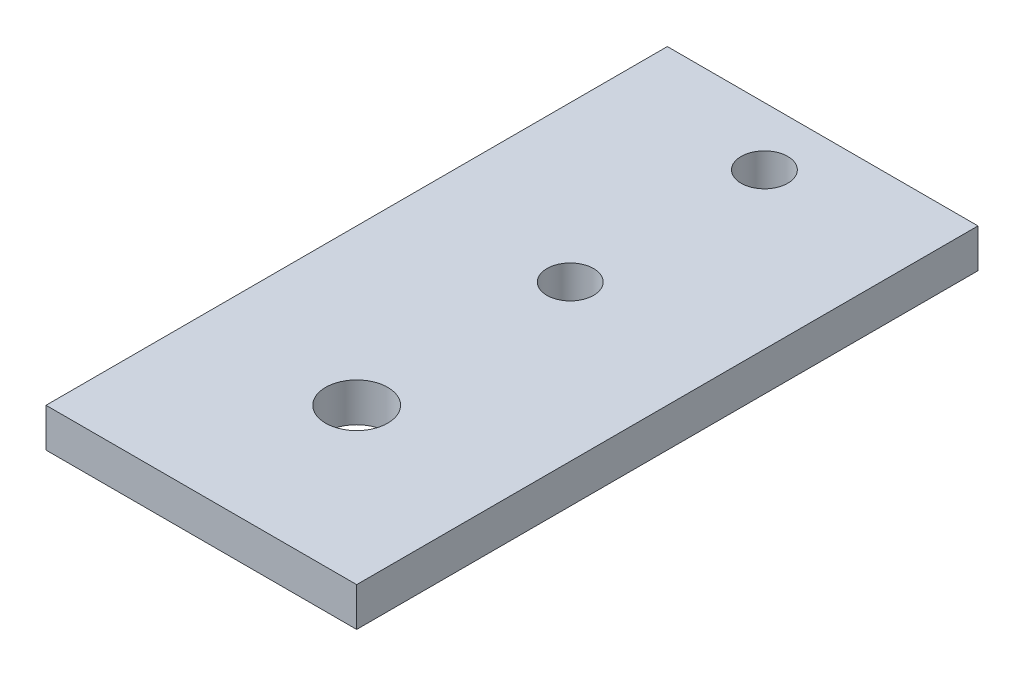
ISO-10303-21;
HEADER;
FILE_DESCRIPTION(('STEP AP214'),'2;1');
FILE_NAME('part.step','',(''),(''),'','','');
FILE_SCHEMA(('AUTOMOTIVE_DESIGN { 1 0 10303 214 1 1 1 1 }'));
ENDSEC;
DATA;
#1=APPLICATION_CONTEXT('core data for automotive mechanical design processes');
#2=APPLICATION_PROTOCOL_DEFINITION('international standard','automotive_design',2000,#1);
#3=PRODUCT_CONTEXT('',#1,'mechanical');
#4=PRODUCT('Part','Part','',(#3));
#5=PRODUCT_RELATED_PRODUCT_CATEGORY('part','',(#4));
#6=PRODUCT_DEFINITION_FORMATION('','',#4);
#7=PRODUCT_DEFINITION_CONTEXT('part definition',#1,'design');
#8=PRODUCT_DEFINITION('design','',#6,#7);
#9=PRODUCT_DEFINITION_SHAPE('','',#8);
#10=(LENGTH_UNIT() NAMED_UNIT(*) SI_UNIT(.MILLI.,.METRE.));
#11=(NAMED_UNIT(*) PLANE_ANGLE_UNIT() SI_UNIT($,.RADIAN.));
#12=(NAMED_UNIT(*) SI_UNIT($,.STERADIAN.) SOLID_ANGLE_UNIT());
#13=UNCERTAINTY_MEASURE_WITH_UNIT(LENGTH_MEASURE(1.E-05),#10,'distance_accuracy_value','');
#14=(GEOMETRIC_REPRESENTATION_CONTEXT(3) GLOBAL_UNCERTAINTY_ASSIGNED_CONTEXT((#13)) GLOBAL_UNIT_ASSIGNED_CONTEXT((#10,
#11,#12)) REPRESENTATION_CONTEXT('',''));
#15=CARTESIAN_POINT('',(0.,0.,0.));
#16=DIRECTION('',(0.,0.,1.));
#17=DIRECTION('',(1.,0.,0.));
#18=AXIS2_PLACEMENT_3D('',#15,#16,#17);
#19=CARTESIAN_POINT('',(0.,5.,0.));
#20=DIRECTION('',(0.,-1.,0.));
#21=DIRECTION('',(0.,0.,-1.));
#22=AXIS2_PLACEMENT_3D('',#19,#20,#21);
#23=PLANE('',#22);
#24=DIRECTION('',(0.,0.,1.));
#25=VECTOR('',#24,1.);
#26=CARTESIAN_POINT('',(0.,5.,0.));
#27=LINE('',#26,#25);
#28=CARTESIAN_POINT('',(0.,5.,-80.));
#29=VERTEX_POINT('',#28);
#30=CARTESIAN_POINT('',(0.,5.,0.));
#31=VERTEX_POINT('',#30);
#32=EDGE_CURVE('E84',#29,#31,#27,.T.);
#33=ORIENTED_EDGE('',*,*,#32,.T.);
#34=DIRECTION('',(1.,0.,0.));
#35=VECTOR('',#34,1.);
#36=CARTESIAN_POINT('',(0.,5.,0.));
#37=LINE('',#36,#35);
#38=CARTESIAN_POINT('',(40.,5.,0.));
#39=VERTEX_POINT('',#38);
#40=EDGE_CURVE('E79',#31,#39,#37,.T.);
#41=ORIENTED_EDGE('',*,*,#40,.T.);
#42=DIRECTION('',(0.,0.,-1.));
#43=VECTOR('',#42,1.);
#44=CARTESIAN_POINT('',(40.,5.,0.));
#45=LINE('',#44,#43);
#46=CARTESIAN_POINT('',(40.,5.,-80.));
#47=VERTEX_POINT('',#46);
#48=EDGE_CURVE('E82',#39,#47,#45,.T.);
#49=ORIENTED_EDGE('',*,*,#48,.T.);
#50=DIRECTION('',(-1.,0.,0.));
#51=VECTOR('',#50,1.);
#52=CARTESIAN_POINT('',(0.,5.,-80.));
#53=LINE('',#52,#51);
#54=EDGE_CURVE('E49',#47,#29,#53,.T.);
#55=ORIENTED_EDGE('',*,*,#54,.T.);
#56=EDGE_LOOP('',(#33,#41,#49,#55));
#57=FACE_BOUND('',#56,.T.);
#58=CARTESIAN_POINT('',(20.,5.,-72.5));
#59=DIRECTION('',(0.,1.,0.));
#60=DIRECTION('',(0.,0.,1.));
#61=AXIS2_PLACEMENT_3D('',#58,#59,#60);
#62=CIRCLE('',#61,3.);
#63=CARTESIAN_POINT('',(20.,5.,-69.5));
#64=VERTEX_POINT('',#63);
#65=EDGE_CURVE('E99',#64,#64,#62,.T.);
#66=ORIENTED_EDGE('',*,*,#65,.F.);
#67=EDGE_LOOP('',(#66));
#68=FACE_BOUND('',#67,.T.);
#69=CARTESIAN_POINT('',(20.,5.,-47.5));
#70=DIRECTION('',(0.,1.,0.));
#71=DIRECTION('',(0.,0.,1.));
#72=AXIS2_PLACEMENT_3D('',#69,#70,#71);
#73=CIRCLE('',#72,3.);
#74=CARTESIAN_POINT('',(20.,5.,-44.5));
#75=VERTEX_POINT('',#74);
#76=EDGE_CURVE('E114',#75,#75,#73,.T.);
#77=ORIENTED_EDGE('',*,*,#76,.F.);
#78=EDGE_LOOP('',(#77));
#79=FACE_BOUND('',#78,.T.);
#80=CARTESIAN_POINT('',(20.,5.,-20.));
#81=DIRECTION('',(0.,1.,0.));
#82=DIRECTION('',(0.,0.,1.));
#83=AXIS2_PLACEMENT_3D('',#80,#81,#82);
#84=CIRCLE('',#83,4.);
#85=CARTESIAN_POINT('',(20.,5.,-16.));
#86=VERTEX_POINT('',#85);
#87=EDGE_CURVE('E120',#86,#86,#84,.T.);
#88=ORIENTED_EDGE('',*,*,#87,.F.);
#89=EDGE_LOOP('',(#88));
#90=FACE_BOUND('',#89,.T.);
#91=ADVANCED_FACE('F32',(#57,#68,#79,#90),#23,.F.);
#92=CARTESIAN_POINT('',(0.,0.,0.));
#93=DIRECTION('',(0.,-1.,0.));
#94=DIRECTION('',(0.,0.,-1.));
#95=AXIS2_PLACEMENT_3D('',#92,#93,#94);
#96=PLANE('',#95);
#97=CARTESIAN_POINT('',(20.,0.,-47.5));
#98=DIRECTION('',(0.,1.,0.));
#99=DIRECTION('',(0.,0.,1.));
#100=AXIS2_PLACEMENT_3D('',#97,#98,#99);
#101=CIRCLE('',#100,3.);
#102=CARTESIAN_POINT('',(20.,0.,-44.5));
#103=VERTEX_POINT('',#102);
#104=EDGE_CURVE('E117',#103,#103,#101,.T.);
#105=ORIENTED_EDGE('',*,*,#104,.T.);
#106=EDGE_LOOP('',(#105));
#107=FACE_BOUND('',#106,.T.);
#108=DIRECTION('',(0.,0.,1.));
#109=VECTOR('',#108,1.);
#110=CARTESIAN_POINT('',(0.,0.,0.));
#111=LINE('',#110,#109);
#112=CARTESIAN_POINT('',(0.,0.,-80.));
#113=VERTEX_POINT('',#112);
#114=CARTESIAN_POINT('',(0.,0.,0.));
#115=VERTEX_POINT('',#114);
#116=EDGE_CURVE('E96',#113,#115,#111,.T.);
#117=ORIENTED_EDGE('',*,*,#116,.F.);
#118=DIRECTION('',(-1.,0.,0.));
#119=VECTOR('',#118,1.);
#120=CARTESIAN_POINT('',(0.,0.,-80.));
#121=LINE('',#120,#119);
#122=CARTESIAN_POINT('',(40.,0.,-80.));
#123=VERTEX_POINT('',#122);
#124=EDGE_CURVE('E72',#123,#113,#121,.T.);
#125=ORIENTED_EDGE('',*,*,#124,.F.);
#126=DIRECTION('',(0.,0.,-1.));
#127=VECTOR('',#126,1.);
#128=CARTESIAN_POINT('',(40.,0.,0.));
#129=LINE('',#128,#127);
#130=CARTESIAN_POINT('',(40.,0.,0.));
#131=VERTEX_POINT('',#130);
#132=EDGE_CURVE('E66',#131,#123,#129,.T.);
#133=ORIENTED_EDGE('',*,*,#132,.F.);
#134=DIRECTION('',(1.,0.,0.));
#135=VECTOR('',#134,1.);
#136=CARTESIAN_POINT('',(0.,0.,0.));
#137=LINE('',#136,#135);
#138=EDGE_CURVE('E88',#115,#131,#137,.T.);
#139=ORIENTED_EDGE('',*,*,#138,.F.);
#140=EDGE_LOOP('',(#117,#125,#133,#139));
#141=FACE_BOUND('',#140,.T.);
#142=CARTESIAN_POINT('',(20.,0.,-72.5));
#143=DIRECTION('',(0.,1.,0.));
#144=DIRECTION('',(0.,0.,1.));
#145=AXIS2_PLACEMENT_3D('',#142,#143,#144);
#146=CIRCLE('',#145,3.);
#147=CARTESIAN_POINT('',(20.,0.,-69.5));
#148=VERTEX_POINT('',#147);
#149=EDGE_CURVE('E111',#148,#148,#146,.T.);
#150=ORIENTED_EDGE('',*,*,#149,.T.);
#151=EDGE_LOOP('',(#150));
#152=FACE_BOUND('',#151,.T.);
#153=CARTESIAN_POINT('',(20.,0.,-20.));
#154=DIRECTION('',(0.,1.,0.));
#155=DIRECTION('',(0.,0.,1.));
#156=AXIS2_PLACEMENT_3D('',#153,#154,#155);
#157=CIRCLE('',#156,4.);
#158=CARTESIAN_POINT('',(20.,0.,-16.));
#159=VERTEX_POINT('',#158);
#160=EDGE_CURVE('E123',#159,#159,#157,.T.);
#161=ORIENTED_EDGE('',*,*,#160,.T.);
#162=EDGE_LOOP('',(#161));
#163=FACE_BOUND('',#162,.T.);
#164=ADVANCED_FACE('F107',(#107,#141,#152,#163),#96,.T.);
#165=CARTESIAN_POINT('',(0.,5.,0.));
#166=DIRECTION('',(1.,0.,0.));
#167=DIRECTION('',(0.,0.,-1.));
#168=AXIS2_PLACEMENT_3D('',#165,#166,#167);
#169=PLANE('',#168);
#170=ORIENTED_EDGE('',*,*,#116,.T.);
#171=DIRECTION('',(0.,-1.,0.));
#172=VECTOR('',#171,1.);
#173=CARTESIAN_POINT('',(0.,5.,0.));
#174=LINE('',#173,#172);
#175=EDGE_CURVE('E11',#31,#115,#174,.T.);
#176=ORIENTED_EDGE('',*,*,#175,.F.);
#177=ORIENTED_EDGE('',*,*,#32,.F.);
#178=DIRECTION('',(0.,-1.,0.));
#179=VECTOR('',#178,1.);
#180=CARTESIAN_POINT('',(0.,5.,-80.));
#181=LINE('',#180,#179);
#182=EDGE_CURVE('E92',#29,#113,#181,.T.);
#183=ORIENTED_EDGE('',*,*,#182,.T.);
#184=EDGE_LOOP('',(#170,#176,#177,#183));
#185=FACE_BOUND('',#184,.T.);
#186=ADVANCED_FACE('F34',(#185),#169,.F.);
#187=CARTESIAN_POINT('',(0.,5.,0.));
#188=DIRECTION('',(0.,0.,-1.));
#189=DIRECTION('',(-1.,0.,0.));
#190=AXIS2_PLACEMENT_3D('',#187,#188,#189);
#191=PLANE('',#190);
#192=ORIENTED_EDGE('',*,*,#138,.T.);
#193=DIRECTION('',(0.,-1.,0.));
#194=VECTOR('',#193,1.);
#195=CARTESIAN_POINT('',(40.,5.,0.));
#196=LINE('',#195,#194);
#197=EDGE_CURVE('E41',#39,#131,#196,.T.);
#198=ORIENTED_EDGE('',*,*,#197,.F.);
#199=ORIENTED_EDGE('',*,*,#40,.F.);
#200=ORIENTED_EDGE('',*,*,#175,.T.);
#201=EDGE_LOOP('',(#192,#198,#199,#200));
#202=FACE_BOUND('',#201,.T.);
#203=ADVANCED_FACE('F87',(#202),#191,.F.);
#204=CARTESIAN_POINT('',(40.,5.,0.));
#205=DIRECTION('',(-1.,0.,0.));
#206=DIRECTION('',(0.,0.,1.));
#207=AXIS2_PLACEMENT_3D('',#204,#205,#206);
#208=PLANE('',#207);
#209=ORIENTED_EDGE('',*,*,#132,.T.);
#210=DIRECTION('',(0.,-1.,0.));
#211=VECTOR('',#210,1.);
#212=CARTESIAN_POINT('',(40.,5.,-80.));
#213=LINE('',#212,#211);
#214=EDGE_CURVE('E89',#47,#123,#213,.T.);
#215=ORIENTED_EDGE('',*,*,#214,.F.);
#216=ORIENTED_EDGE('',*,*,#48,.F.);
#217=ORIENTED_EDGE('',*,*,#197,.T.);
#218=EDGE_LOOP('',(#209,#215,#216,#217));
#219=FACE_BOUND('',#218,.T.);
#220=ADVANCED_FACE('F90',(#219),#208,.F.);
#221=CARTESIAN_POINT('',(0.,5.,-80.));
#222=DIRECTION('',(0.,0.,1.));
#223=DIRECTION('',(1.,0.,0.));
#224=AXIS2_PLACEMENT_3D('',#221,#222,#223);
#225=PLANE('',#224);
#226=ORIENTED_EDGE('',*,*,#124,.T.);
#227=ORIENTED_EDGE('',*,*,#182,.F.);
#228=ORIENTED_EDGE('',*,*,#54,.F.);
#229=ORIENTED_EDGE('',*,*,#214,.T.);
#230=EDGE_LOOP('',(#226,#227,#228,#229));
#231=FACE_BOUND('',#230,.T.);
#232=ADVANCED_FACE('F104',(#231),#225,.F.);
#233=CARTESIAN_POINT('',(20.,5.,-72.5));
#234=DIRECTION('',(0.,-1.,0.));
#235=DIRECTION('',(0.,0.,-1.));
#236=AXIS2_PLACEMENT_3D('',#233,#234,#235);
#237=CYLINDRICAL_SURFACE('',#236,3.);
#238=ORIENTED_EDGE('',*,*,#65,.T.);
#239=EDGE_LOOP('',(#238));
#240=FACE_BOUND('',#239,.T.);
#241=ORIENTED_EDGE('',*,*,#149,.F.);
#242=EDGE_LOOP('',(#241));
#243=FACE_BOUND('',#242,.T.);
#244=ADVANCED_FACE('F140',(#240,#243),#237,.F.);
#245=CARTESIAN_POINT('',(20.,5.,-47.5));
#246=DIRECTION('',(0.,-1.,0.));
#247=DIRECTION('',(0.,0.,-1.));
#248=AXIS2_PLACEMENT_3D('',#245,#246,#247);
#249=CYLINDRICAL_SURFACE('',#248,3.);
#250=ORIENTED_EDGE('',*,*,#76,.T.);
#251=EDGE_LOOP('',(#250));
#252=FACE_BOUND('',#251,.T.);
#253=ORIENTED_EDGE('',*,*,#104,.F.);
#254=EDGE_LOOP('',(#253));
#255=FACE_BOUND('',#254,.T.);
#256=ADVANCED_FACE('F186',(#252,#255),#249,.F.);
#257=CARTESIAN_POINT('',(20.,5.,-20.));
#258=DIRECTION('',(0.,-1.,0.));
#259=DIRECTION('',(0.,0.,-1.));
#260=AXIS2_PLACEMENT_3D('',#257,#258,#259);
#261=CYLINDRICAL_SURFACE('',#260,4.);
#262=ORIENTED_EDGE('',*,*,#87,.T.);
#263=EDGE_LOOP('',(#262));
#264=FACE_BOUND('',#263,.T.);
#265=ORIENTED_EDGE('',*,*,#160,.F.);
#266=EDGE_LOOP('',(#265));
#267=FACE_BOUND('',#266,.T.);
#268=ADVANCED_FACE('F129',(#264,#267),#261,.F.);
#269=CLOSED_SHELL('',(#91,#164,#186,#203,#220,#232,#244,#256,#268));
#270=MANIFOLD_SOLID_BREP('B2',#269);
#271=ADVANCED_BREP_SHAPE_REPRESENTATION('',(#18,#270),#14);
#272=SHAPE_DEFINITION_REPRESENTATION(#9,#271);
ENDSEC;
END-ISO-10303-21;
